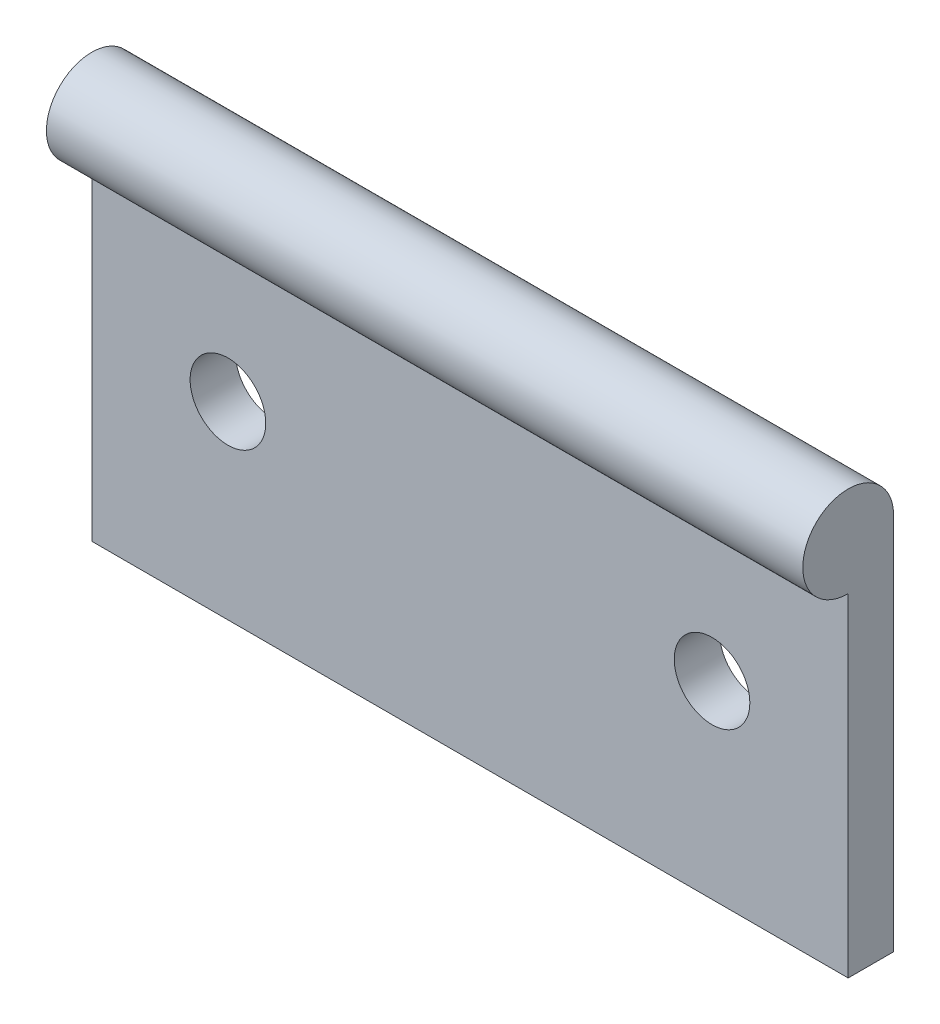
ISO-10303-21;
HEADER;
FILE_DESCRIPTION(('STEP AP214'),'2;1');
FILE_NAME('part.step','',(''),(''),'','','');
FILE_SCHEMA(('AUTOMOTIVE_DESIGN { 1 0 10303 214 1 1 1 1 }'));
ENDSEC;
DATA;
#1=APPLICATION_CONTEXT('core data for automotive mechanical design processes');
#2=APPLICATION_PROTOCOL_DEFINITION('international standard','automotive_design',2000,#1);
#3=PRODUCT_CONTEXT('',#1,'mechanical');
#4=PRODUCT('Part','Part','',(#3));
#5=PRODUCT_RELATED_PRODUCT_CATEGORY('part','',(#4));
#6=PRODUCT_DEFINITION_FORMATION('','',#4);
#7=PRODUCT_DEFINITION_CONTEXT('part definition',#1,'design');
#8=PRODUCT_DEFINITION('design','',#6,#7);
#9=PRODUCT_DEFINITION_SHAPE('','',#8);
#10=(LENGTH_UNIT() NAMED_UNIT(*) SI_UNIT(.MILLI.,.METRE.));
#11=(NAMED_UNIT(*) PLANE_ANGLE_UNIT() SI_UNIT($,.RADIAN.));
#12=(NAMED_UNIT(*) SI_UNIT($,.STERADIAN.) SOLID_ANGLE_UNIT());
#13=UNCERTAINTY_MEASURE_WITH_UNIT(LENGTH_MEASURE(1.E-05),#10,'distance_accuracy_value','');
#14=(GEOMETRIC_REPRESENTATION_CONTEXT(3) GLOBAL_UNCERTAINTY_ASSIGNED_CONTEXT((#13)) GLOBAL_UNIT_ASSIGNED_CONTEXT((#10,
#11,#12)) REPRESENTATION_CONTEXT('',''));
#15=CARTESIAN_POINT('',(0.,0.,0.));
#16=DIRECTION('',(0.,0.,1.));
#17=DIRECTION('',(1.,0.,0.));
#18=AXIS2_PLACEMENT_3D('',#15,#16,#17);
#19=CARTESIAN_POINT('',(0.,0.,2.99999999999995));
#20=DIRECTION('',(0.,0.,0.999999999999963));
#21=DIRECTION('',(1.,0.,0.));
#22=AXIS2_PLACEMENT_3D('',#19,#20,#21);
#23=PLANE('',#22);
#24=CARTESIAN_POINT('',(-16.,0.,2.99999999999995));
#25=DIRECTION('',(0.,0.,1.));
#26=DIRECTION('',(1.,0.,0.));
#27=AXIS2_PLACEMENT_3D('',#24,#25,#26);
#28=CIRCLE('',#27,2.5);
#29=CARTESIAN_POINT('',(-13.5,0.,2.99999999999995));
#30=VERTEX_POINT('',#29);
#31=EDGE_CURVE('E115',#30,#30,#28,.T.);
#32=ORIENTED_EDGE('',*,*,#31,.F.);
#33=EDGE_LOOP('',(#32));
#34=FACE_BOUND('',#33,.T.);
#35=CARTESIAN_POINT('',(16.,0.,2.99999999999995));
#36=DIRECTION('',(0.,0.,1.));
#37=DIRECTION('',(1.,0.,0.));
#38=AXIS2_PLACEMENT_3D('',#35,#36,#37);
#39=CIRCLE('',#38,2.5);
#40=CARTESIAN_POINT('',(18.5,0.,2.99999999999995));
#41=VERTEX_POINT('',#40);
#42=EDGE_CURVE('E218',#41,#41,#39,.T.);
#43=ORIENTED_EDGE('',*,*,#42,.F.);
#44=EDGE_LOOP('',(#43));
#45=FACE_BOUND('',#44,.T.);
#46=DIRECTION('',(0.,1.,0.));
#47=VECTOR('',#46,1.);
#48=CARTESIAN_POINT('',(25.,12.5000000000003,2.99999999999995));
#49=LINE('',#48,#47);
#50=CARTESIAN_POINT('',(25.,-12.4999999999998,2.99999999999995));
#51=VERTEX_POINT('',#50);
#52=CARTESIAN_POINT('',(25.,9.50000000000042,2.99999999999995));
#53=VERTEX_POINT('',#52);
#54=EDGE_CURVE('E66',#51,#53,#49,.T.);
#55=ORIENTED_EDGE('',*,*,#54,.T.);
#56=DIRECTION('',(-1.,0.,0.));
#57=VECTOR('',#56,1.);
#58=CARTESIAN_POINT('',(25.,9.50000000000042,2.99999999999995));
#59=LINE('',#58,#57);
#60=CARTESIAN_POINT('',(-25.,9.49999999999995,2.99999999999995));
#61=VERTEX_POINT('',#60);
#62=EDGE_CURVE('E61',#53,#61,#59,.T.);
#63=ORIENTED_EDGE('',*,*,#62,.T.);
#64=DIRECTION('',(0.,-1.,0.));
#65=VECTOR('',#64,1.);
#66=CARTESIAN_POINT('',(-25.,12.5,2.99999999999995));
#67=LINE('',#66,#65);
#68=CARTESIAN_POINT('',(-25.,-12.5,2.99999999999995));
#69=VERTEX_POINT('',#68);
#70=EDGE_CURVE('E107',#61,#69,#67,.T.);
#71=ORIENTED_EDGE('',*,*,#70,.T.);
#72=DIRECTION('',(1.,0.,0.));
#73=VECTOR('',#72,1.);
#74=CARTESIAN_POINT('',(-25.,-12.5,2.99999999999995));
#75=LINE('',#74,#73);
#76=EDGE_CURVE('E125',#69,#51,#75,.T.);
#77=ORIENTED_EDGE('',*,*,#76,.T.);
#78=EDGE_LOOP('',(#55,#63,#71,#77));
#79=FACE_BOUND('',#78,.T.);
#80=ADVANCED_FACE('F45',(#34,#45,#79),#23,.T.);
#81=CARTESIAN_POINT('',(25.,12.5000000000003,2.99999999999995));
#82=DIRECTION('',(-1.,0.,0.));
#83=DIRECTION('',(0.,-1.,0.));
#84=AXIS2_PLACEMENT_3D('',#81,#82,#83);
#85=PLANE('',#84);
#86=DIRECTION('',(0.,1.,0.));
#87=VECTOR('',#86,1.);
#88=CARTESIAN_POINT('',(25.,12.5000000000003,0.));
#89=LINE('',#88,#87);
#90=CARTESIAN_POINT('',(25.,-12.4999999999998,0.));
#91=VERTEX_POINT('',#90);
#92=CARTESIAN_POINT('',(25.,12.5000000000003,0.));
#93=VERTEX_POINT('',#92);
#94=EDGE_CURVE('E104',#91,#93,#89,.T.);
#95=ORIENTED_EDGE('',*,*,#94,.T.);
#96=CARTESIAN_POINT('',(25.,12.5000000000003,2.99999999999995));
#97=DIRECTION('',(1.,0.,0.));
#98=DIRECTION('',(0.,0.,-0.999999999999963));
#99=AXIS2_PLACEMENT_3D('',#96,#97,#98);
#100=CIRCLE('',#99,3.);
#101=EDGE_CURVE('E102',#93,#53,#100,.T.);
#102=ORIENTED_EDGE('',*,*,#101,.T.);
#103=ORIENTED_EDGE('',*,*,#54,.F.);
#104=DIRECTION('',(0.,0.,-0.999999999999963));
#105=VECTOR('',#104,1.);
#106=CARTESIAN_POINT('',(25.,-12.4999999999998,2.99999999999995));
#107=LINE('',#106,#105);
#108=EDGE_CURVE('E54',#51,#91,#107,.T.);
#109=ORIENTED_EDGE('',*,*,#108,.T.);
#110=EDGE_LOOP('',(#95,#102,#103,#109));
#111=FACE_BOUND('',#110,.T.);
#112=ADVANCED_FACE('F47',(#111),#85,.F.);
#113=CARTESIAN_POINT('',(-25.,12.5,2.99999999999995));
#114=DIRECTION('',(1.,0.,0.));
#115=DIRECTION('',(0.,1.,0.));
#116=AXIS2_PLACEMENT_3D('',#113,#114,#115);
#117=PLANE('',#116);
#118=CARTESIAN_POINT('',(-25.,12.5,2.99999999999995));
#119=DIRECTION('',(1.,0.,0.));
#120=DIRECTION('',(0.,0.,-0.999999999999963));
#121=AXIS2_PLACEMENT_3D('',#118,#119,#120);
#122=CIRCLE('',#121,3.);
#123=CARTESIAN_POINT('',(-25.,12.5,0.));
#124=VERTEX_POINT('',#123);
#125=EDGE_CURVE('E100',#124,#61,#122,.T.);
#126=ORIENTED_EDGE('',*,*,#125,.F.);
#127=DIRECTION('',(0.,-1.,0.));
#128=VECTOR('',#127,1.);
#129=CARTESIAN_POINT('',(-25.,12.5,0.));
#130=LINE('',#129,#128);
#131=CARTESIAN_POINT('',(-25.,-12.5,0.));
#132=VERTEX_POINT('',#131);
#133=EDGE_CURVE('E84',#124,#132,#130,.T.);
#134=ORIENTED_EDGE('',*,*,#133,.T.);
#135=DIRECTION('',(0.,0.,-0.999999999999963));
#136=VECTOR('',#135,1.);
#137=CARTESIAN_POINT('',(-25.,-12.5,2.99999999999995));
#138=LINE('',#137,#136);
#139=EDGE_CURVE('E11',#69,#132,#138,.T.);
#140=ORIENTED_EDGE('',*,*,#139,.F.);
#141=ORIENTED_EDGE('',*,*,#70,.F.);
#142=EDGE_LOOP('',(#126,#134,#140,#141));
#143=FACE_BOUND('',#142,.T.);
#144=ADVANCED_FACE('F106',(#143),#117,.F.);
#145=CARTESIAN_POINT('',(-25.,-12.5,2.99999999999995));
#146=DIRECTION('',(0.,1.,0.));
#147=DIRECTION('',(0.,0.,0.999999999999963));
#148=AXIS2_PLACEMENT_3D('',#145,#146,#147);
#149=PLANE('',#148);
#150=DIRECTION('',(1.,0.,0.));
#151=VECTOR('',#150,1.);
#152=CARTESIAN_POINT('',(-25.,-12.5,0.));
#153=LINE('',#152,#151);
#154=EDGE_CURVE('E90',#132,#91,#153,.T.);
#155=ORIENTED_EDGE('',*,*,#154,.T.);
#156=ORIENTED_EDGE('',*,*,#108,.F.);
#157=ORIENTED_EDGE('',*,*,#76,.F.);
#158=ORIENTED_EDGE('',*,*,#139,.T.);
#159=EDGE_LOOP('',(#155,#156,#157,#158));
#160=FACE_BOUND('',#159,.T.);
#161=ADVANCED_FACE('F138',(#160),#149,.F.);
#162=CARTESIAN_POINT('',(0.,0.,0.));
#163=DIRECTION('',(0.,0.,0.999999999999963));
#164=DIRECTION('',(1.,0.,0.));
#165=AXIS2_PLACEMENT_3D('',#162,#163,#164);
#166=PLANE('',#165);
#167=CARTESIAN_POINT('',(-16.,0.,0.));
#168=DIRECTION('',(0.,0.,1.));
#169=DIRECTION('',(1.,0.,0.));
#170=AXIS2_PLACEMENT_3D('',#167,#168,#169);
#171=CIRCLE('',#170,2.5);
#172=CARTESIAN_POINT('',(-13.5,0.,0.));
#173=VERTEX_POINT('',#172);
#174=EDGE_CURVE('E109',#173,#173,#171,.T.);
#175=ORIENTED_EDGE('',*,*,#174,.T.);
#176=EDGE_LOOP('',(#175));
#177=FACE_BOUND('',#176,.T.);
#178=CARTESIAN_POINT('',(16.,0.,0.));
#179=DIRECTION('',(0.,0.,1.));
#180=DIRECTION('',(1.,0.,0.));
#181=AXIS2_PLACEMENT_3D('',#178,#179,#180);
#182=CIRCLE('',#181,2.5);
#183=CARTESIAN_POINT('',(18.5,0.,0.));
#184=VERTEX_POINT('',#183);
#185=EDGE_CURVE('E221',#184,#184,#182,.T.);
#186=ORIENTED_EDGE('',*,*,#185,.T.);
#187=EDGE_LOOP('',(#186));
#188=FACE_BOUND('',#187,.T.);
#189=ORIENTED_EDGE('',*,*,#94,.F.);
#190=ORIENTED_EDGE('',*,*,#154,.F.);
#191=ORIENTED_EDGE('',*,*,#133,.F.);
#192=DIRECTION('',(-1.,0.,0.));
#193=VECTOR('',#192,1.);
#194=CARTESIAN_POINT('',(-25.,12.5,0.));
#195=LINE('',#194,#193);
#196=EDGE_CURVE('E88',#93,#124,#195,.T.);
#197=ORIENTED_EDGE('',*,*,#196,.F.);
#198=EDGE_LOOP('',(#189,#190,#191,#197));
#199=FACE_BOUND('',#198,.T.);
#200=ADVANCED_FACE('F87',(#177,#188,#199),#166,.F.);
#201=CARTESIAN_POINT('',(25.,12.5000000000003,2.99999999999995));
#202=DIRECTION('',(-1.,0.,0.));
#203=DIRECTION('',(0.,0.,0.999999999999963));
#204=AXIS2_PLACEMENT_3D('',#201,#202,#203);
#205=CYLINDRICAL_SURFACE('',#204,3.);
#206=ORIENTED_EDGE('',*,*,#62,.F.);
#207=ORIENTED_EDGE('',*,*,#101,.F.);
#208=ORIENTED_EDGE('',*,*,#196,.T.);
#209=ORIENTED_EDGE('',*,*,#125,.T.);
#210=EDGE_LOOP('',(#206,#207,#208,#209));
#211=FACE_BOUND('',#210,.T.);
#212=ADVANCED_FACE('F99',(#211),#205,.T.);
#213=CARTESIAN_POINT('',(16.,0.,0.));
#214=DIRECTION('',(0.,0.,1.));
#215=DIRECTION('',(1.,0.,0.));
#216=AXIS2_PLACEMENT_3D('',#213,#214,#215);
#217=CYLINDRICAL_SURFACE('',#216,2.5);
#218=ORIENTED_EDGE('',*,*,#185,.F.);
#219=EDGE_LOOP('',(#218));
#220=FACE_BOUND('',#219,.T.);
#221=ORIENTED_EDGE('',*,*,#42,.T.);
#222=EDGE_LOOP('',(#221));
#223=FACE_BOUND('',#222,.T.);
#224=ADVANCED_FACE('F177',(#220,#223),#217,.F.);
#225=CARTESIAN_POINT('',(-16.,0.,0.));
#226=DIRECTION('',(0.,0.,1.));
#227=DIRECTION('',(1.,0.,0.));
#228=AXIS2_PLACEMENT_3D('',#225,#226,#227);
#229=CYLINDRICAL_SURFACE('',#228,2.5);
#230=ORIENTED_EDGE('',*,*,#174,.F.);
#231=EDGE_LOOP('',(#230));
#232=FACE_BOUND('',#231,.T.);
#233=ORIENTED_EDGE('',*,*,#31,.T.);
#234=EDGE_LOOP('',(#233));
#235=FACE_BOUND('',#234,.T.);
#236=ADVANCED_FACE('F184',(#232,#235),#229,.F.);
#237=CLOSED_SHELL('',(#80,#112,#144,#161,#200,#212,#224,#236));
#238=MANIFOLD_SOLID_BREP('B2',#237);
#239=ADVANCED_BREP_SHAPE_REPRESENTATION('',(#18,#238),#14);
#240=SHAPE_DEFINITION_REPRESENTATION(#9,#239);
ENDSEC;
END-ISO-10303-21;
